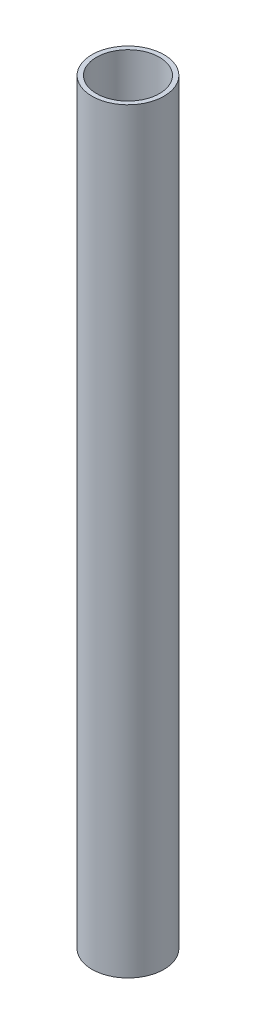
ISO-10303-21;
HEADER;
FILE_DESCRIPTION(('STEP AP214'),'2;1');
FILE_NAME('part.step','',(''),(''),'','','');
FILE_SCHEMA(('AUTOMOTIVE_DESIGN { 1 0 10303 214 1 1 1 1 }'));
ENDSEC;
DATA;
#1=APPLICATION_CONTEXT('core data for automotive mechanical design processes');
#2=APPLICATION_PROTOCOL_DEFINITION('international standard','automotive_design',2000,#1);
#3=PRODUCT_CONTEXT('',#1,'mechanical');
#4=PRODUCT('Part','Part','',(#3));
#5=PRODUCT_RELATED_PRODUCT_CATEGORY('part','',(#4));
#6=PRODUCT_DEFINITION_FORMATION('','',#4);
#7=PRODUCT_DEFINITION_CONTEXT('part definition',#1,'design');
#8=PRODUCT_DEFINITION('design','',#6,#7);
#9=PRODUCT_DEFINITION_SHAPE('','',#8);
#10=(LENGTH_UNIT() NAMED_UNIT(*) SI_UNIT(.MILLI.,.METRE.));
#11=(NAMED_UNIT(*) PLANE_ANGLE_UNIT() SI_UNIT($,.RADIAN.));
#12=(NAMED_UNIT(*) SI_UNIT($,.STERADIAN.) SOLID_ANGLE_UNIT());
#13=UNCERTAINTY_MEASURE_WITH_UNIT(LENGTH_MEASURE(1.E-05),#10,'distance_accuracy_value','');
#14=(GEOMETRIC_REPRESENTATION_CONTEXT(3) GLOBAL_UNCERTAINTY_ASSIGNED_CONTEXT((#13)) GLOBAL_UNIT_ASSIGNED_CONTEXT((#10,
#11,#12)) REPRESENTATION_CONTEXT('',''));
#15=CARTESIAN_POINT('',(0.,0.,0.));
#16=DIRECTION('',(0.,0.,1.));
#17=DIRECTION('',(1.,0.,0.));
#18=AXIS2_PLACEMENT_3D('',#15,#16,#17);
#19=CARTESIAN_POINT('',(0.,1066.8,0.));
#20=DIRECTION('',(0.,1.,0.));
#21=DIRECTION('',(0.,0.,1.));
#22=AXIS2_PLACEMENT_3D('',#19,#20,#21);
#23=PLANE('',#22);
#24=CARTESIAN_POINT('',(0.,1066.8,0.));
#25=DIRECTION('',(0.,1.,0.));
#26=DIRECTION('',(0.,0.,1.));
#27=AXIS2_PLACEMENT_3D('',#24,#25,#26);
#28=CIRCLE('',#27,50.8);
#29=CARTESIAN_POINT('',(0.,1066.8,50.8));
#30=VERTEX_POINT('',#29);
#31=EDGE_CURVE('E10',#30,#30,#28,.T.);
#32=ORIENTED_EDGE('',*,*,#31,.T.);
#33=EDGE_LOOP('',(#32));
#34=FACE_BOUND('',#33,.T.);
#35=CARTESIAN_POINT('',(0.,1066.8,0.));
#36=DIRECTION('',(0.,1.,0.));
#37=DIRECTION('',(0.,0.,1.));
#38=AXIS2_PLACEMENT_3D('',#35,#36,#37);
#39=CIRCLE('',#38,44.45);
#40=CARTESIAN_POINT('',(0.,1066.8,44.45));
#41=VERTEX_POINT('',#40);
#42=EDGE_CURVE('E42',#41,#41,#39,.T.);
#43=ORIENTED_EDGE('',*,*,#42,.F.);
#44=EDGE_LOOP('',(#43));
#45=FACE_BOUND('',#44,.T.);
#46=ADVANCED_FACE('F31',(#34,#45),#23,.T.);
#47=CARTESIAN_POINT('',(0.,0.,0.));
#48=DIRECTION('',(0.,1.,0.));
#49=DIRECTION('',(0.,0.,1.));
#50=AXIS2_PLACEMENT_3D('',#47,#48,#49);
#51=PLANE('',#50);
#52=CARTESIAN_POINT('',(0.,0.,0.));
#53=DIRECTION('',(0.,1.,0.));
#54=DIRECTION('',(0.,0.,1.));
#55=AXIS2_PLACEMENT_3D('',#52,#53,#54);
#56=CIRCLE('',#55,50.8);
#57=CARTESIAN_POINT('',(0.,0.,50.8));
#58=VERTEX_POINT('',#57);
#59=EDGE_CURVE('E35',#58,#58,#56,.T.);
#60=ORIENTED_EDGE('',*,*,#59,.F.);
#61=EDGE_LOOP('',(#60));
#62=FACE_BOUND('',#61,.T.);
#63=CARTESIAN_POINT('',(0.,0.,0.));
#64=DIRECTION('',(0.,1.,0.));
#65=DIRECTION('',(0.,0.,1.));
#66=AXIS2_PLACEMENT_3D('',#63,#64,#65);
#67=CIRCLE('',#66,44.45);
#68=CARTESIAN_POINT('',(0.,0.,44.45));
#69=VERTEX_POINT('',#68);
#70=EDGE_CURVE('E44',#69,#69,#67,.T.);
#71=ORIENTED_EDGE('',*,*,#70,.T.);
#72=EDGE_LOOP('',(#71));
#73=FACE_BOUND('',#72,.T.);
#74=ADVANCED_FACE('F54',(#62,#73),#51,.F.);
#75=CARTESIAN_POINT('',(0.,1066.8,0.));
#76=DIRECTION('',(0.,-1.,0.));
#77=DIRECTION('',(0.,0.,-1.));
#78=AXIS2_PLACEMENT_3D('',#75,#76,#77);
#79=CYLINDRICAL_SURFACE('',#78,50.8);
#80=ORIENTED_EDGE('',*,*,#31,.F.);
#81=EDGE_LOOP('',(#80));
#82=FACE_BOUND('',#81,.T.);
#83=ORIENTED_EDGE('',*,*,#59,.T.);
#84=EDGE_LOOP('',(#83));
#85=FACE_BOUND('',#84,.T.);
#86=ADVANCED_FACE('F33',(#82,#85),#79,.T.);
#87=CARTESIAN_POINT('',(0.,1066.8,0.));
#88=DIRECTION('',(0.,-1.,0.));
#89=DIRECTION('',(0.,0.,-1.));
#90=AXIS2_PLACEMENT_3D('',#87,#88,#89);
#91=CYLINDRICAL_SURFACE('',#90,44.45);
#92=ORIENTED_EDGE('',*,*,#42,.T.);
#93=EDGE_LOOP('',(#92));
#94=FACE_BOUND('',#93,.T.);
#95=ORIENTED_EDGE('',*,*,#70,.F.);
#96=EDGE_LOOP('',(#95));
#97=FACE_BOUND('',#96,.T.);
#98=ADVANCED_FACE('F50',(#94,#97),#91,.F.);
#99=CLOSED_SHELL('',(#46,#74,#86,#98));
#100=MANIFOLD_SOLID_BREP('B2',#99);
#101=ADVANCED_BREP_SHAPE_REPRESENTATION('',(#18,#100),#14);
#102=SHAPE_DEFINITION_REPRESENTATION(#9,#101);
ENDSEC;
END-ISO-10303-21;
